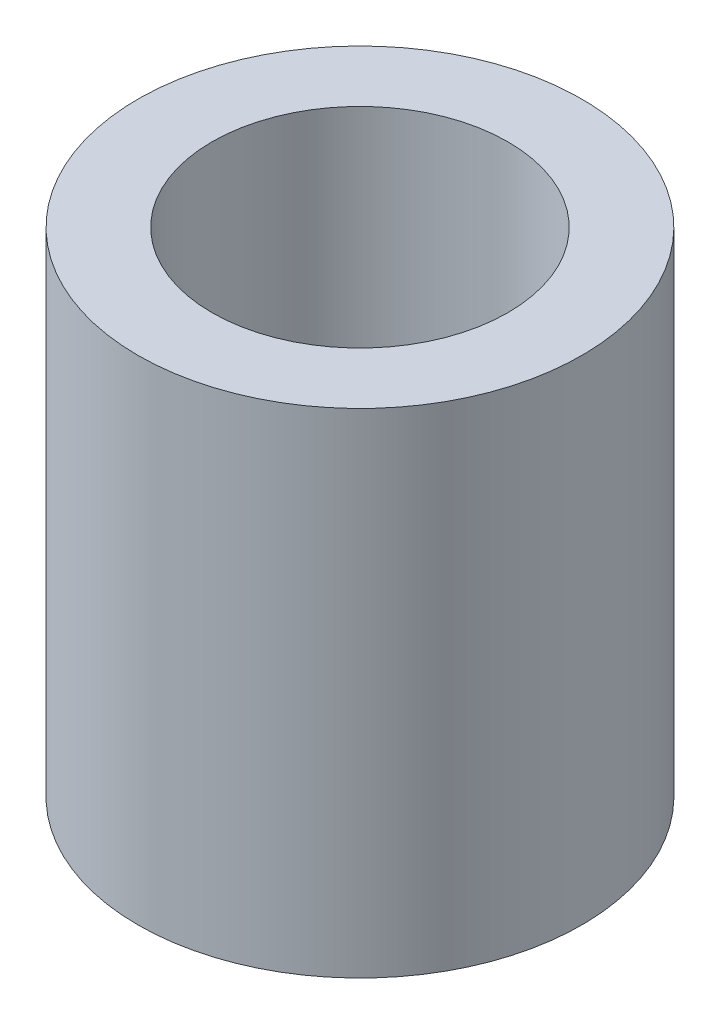
ISO-10303-21;
HEADER;
FILE_DESCRIPTION(('STEP AP214'),'2;1');
FILE_NAME('part.step','',(''),(''),'','','');
FILE_SCHEMA(('AUTOMOTIVE_DESIGN { 1 0 10303 214 1 1 1 1 }'));
ENDSEC;
DATA;
#1=APPLICATION_CONTEXT('core data for automotive mechanical design processes');
#2=APPLICATION_PROTOCOL_DEFINITION('international standard','automotive_design',2000,#1);
#3=PRODUCT_CONTEXT('',#1,'mechanical');
#4=PRODUCT('Part','Part','',(#3));
#5=PRODUCT_RELATED_PRODUCT_CATEGORY('part','',(#4));
#6=PRODUCT_DEFINITION_FORMATION('','',#4);
#7=PRODUCT_DEFINITION_CONTEXT('part definition',#1,'design');
#8=PRODUCT_DEFINITION('design','',#6,#7);
#9=PRODUCT_DEFINITION_SHAPE('','',#8);
#10=(LENGTH_UNIT() NAMED_UNIT(*) SI_UNIT(.MILLI.,.METRE.));
#11=(NAMED_UNIT(*) PLANE_ANGLE_UNIT() SI_UNIT($,.RADIAN.));
#12=(NAMED_UNIT(*) SI_UNIT($,.STERADIAN.) SOLID_ANGLE_UNIT());
#13=UNCERTAINTY_MEASURE_WITH_UNIT(LENGTH_MEASURE(1.E-05),#10,'distance_accuracy_value','');
#14=(GEOMETRIC_REPRESENTATION_CONTEXT(3) GLOBAL_UNCERTAINTY_ASSIGNED_CONTEXT((#13)) GLOBAL_UNIT_ASSIGNED_CONTEXT((#10,
#11,#12)) REPRESENTATION_CONTEXT('',''));
#15=CARTESIAN_POINT('',(0.,0.,0.));
#16=DIRECTION('',(0.,0.,1.));
#17=DIRECTION('',(1.,0.,0.));
#18=AXIS2_PLACEMENT_3D('',#15,#16,#17);
#19=CARTESIAN_POINT('',(0.,10.,0.));
#20=DIRECTION('',(0.,1.,0.));
#21=DIRECTION('',(0.,0.,1.));
#22=AXIS2_PLACEMENT_3D('',#19,#20,#21);
#23=PLANE('',#22);
#24=CARTESIAN_POINT('',(0.,10.,0.));
#25=DIRECTION('',(0.,1.,0.));
#26=DIRECTION('',(0.,0.,1.));
#27=AXIS2_PLACEMENT_3D('',#24,#25,#26);
#28=CIRCLE('',#27,4.5);
#29=CARTESIAN_POINT('',(0.,10.,4.5));
#30=VERTEX_POINT('',#29);
#31=EDGE_CURVE('E10',#30,#30,#28,.T.);
#32=ORIENTED_EDGE('',*,*,#31,.T.);
#33=EDGE_LOOP('',(#32));
#34=FACE_BOUND('',#33,.T.);
#35=CARTESIAN_POINT('',(0.,10.,0.));
#36=DIRECTION('',(0.,1.,0.));
#37=DIRECTION('',(0.,0.,1.));
#38=AXIS2_PLACEMENT_3D('',#35,#36,#37);
#39=CIRCLE('',#38,3.);
#40=CARTESIAN_POINT('',(0.,10.,3.));
#41=VERTEX_POINT('',#40);
#42=EDGE_CURVE('E50',#41,#41,#39,.T.);
#43=ORIENTED_EDGE('',*,*,#42,.F.);
#44=EDGE_LOOP('',(#43));
#45=FACE_BOUND('',#44,.T.);
#46=ADVANCED_FACE('F39',(#34,#45),#23,.T.);
#47=CARTESIAN_POINT('',(0.,0.,0.));
#48=DIRECTION('',(0.,1.,0.));
#49=DIRECTION('',(0.,0.,1.));
#50=AXIS2_PLACEMENT_3D('',#47,#48,#49);
#51=PLANE('',#50);
#52=CARTESIAN_POINT('',(0.,0.,0.));
#53=DIRECTION('',(0.,1.,0.));
#54=DIRECTION('',(0.,0.,1.));
#55=AXIS2_PLACEMENT_3D('',#52,#53,#54);
#56=CIRCLE('',#55,4.5);
#57=CARTESIAN_POINT('',(0.,0.,4.5));
#58=VERTEX_POINT('',#57);
#59=EDGE_CURVE('E43',#58,#58,#56,.T.);
#60=ORIENTED_EDGE('',*,*,#59,.F.);
#61=EDGE_LOOP('',(#60));
#62=FACE_BOUND('',#61,.T.);
#63=CARTESIAN_POINT('',(0.,0.,0.));
#64=DIRECTION('',(0.,1.,0.));
#65=DIRECTION('',(0.,0.,1.));
#66=AXIS2_PLACEMENT_3D('',#63,#64,#65);
#67=CIRCLE('',#66,3.);
#68=CARTESIAN_POINT('',(0.,0.,3.));
#69=VERTEX_POINT('',#68);
#70=EDGE_CURVE('E52',#69,#69,#67,.T.);
#71=ORIENTED_EDGE('',*,*,#70,.T.);
#72=EDGE_LOOP('',(#71));
#73=FACE_BOUND('',#72,.T.);
#74=ADVANCED_FACE('F62',(#62,#73),#51,.F.);
#75=CARTESIAN_POINT('',(0.,10.,0.));
#76=DIRECTION('',(0.,-1.,0.));
#77=DIRECTION('',(0.,0.,-1.));
#78=AXIS2_PLACEMENT_3D('',#75,#76,#77);
#79=CYLINDRICAL_SURFACE('',#78,4.5);
#80=ORIENTED_EDGE('',*,*,#31,.F.);
#81=EDGE_LOOP('',(#80));
#82=FACE_BOUND('',#81,.T.);
#83=ORIENTED_EDGE('',*,*,#59,.T.);
#84=EDGE_LOOP('',(#83));
#85=FACE_BOUND('',#84,.T.);
#86=ADVANCED_FACE('F41',(#82,#85),#79,.T.);
#87=CARTESIAN_POINT('',(0.,10.,0.));
#88=DIRECTION('',(0.,-1.,0.));
#89=DIRECTION('',(0.,0.,-1.));
#90=AXIS2_PLACEMENT_3D('',#87,#88,#89);
#91=CYLINDRICAL_SURFACE('',#90,3.);
#92=ORIENTED_EDGE('',*,*,#42,.T.);
#93=EDGE_LOOP('',(#92));
#94=FACE_BOUND('',#93,.T.);
#95=ORIENTED_EDGE('',*,*,#70,.F.);
#96=EDGE_LOOP('',(#95));
#97=FACE_BOUND('',#96,.T.);
#98=ADVANCED_FACE('F58',(#94,#97),#91,.F.);
#99=CLOSED_SHELL('',(#46,#74,#86,#98));
#100=MANIFOLD_SOLID_BREP('B2',#99);
#101=ADVANCED_BREP_SHAPE_REPRESENTATION('',(#18,#100),#14);
#102=SHAPE_DEFINITION_REPRESENTATION(#9,#101);
ENDSEC;
END-ISO-10303-21;
